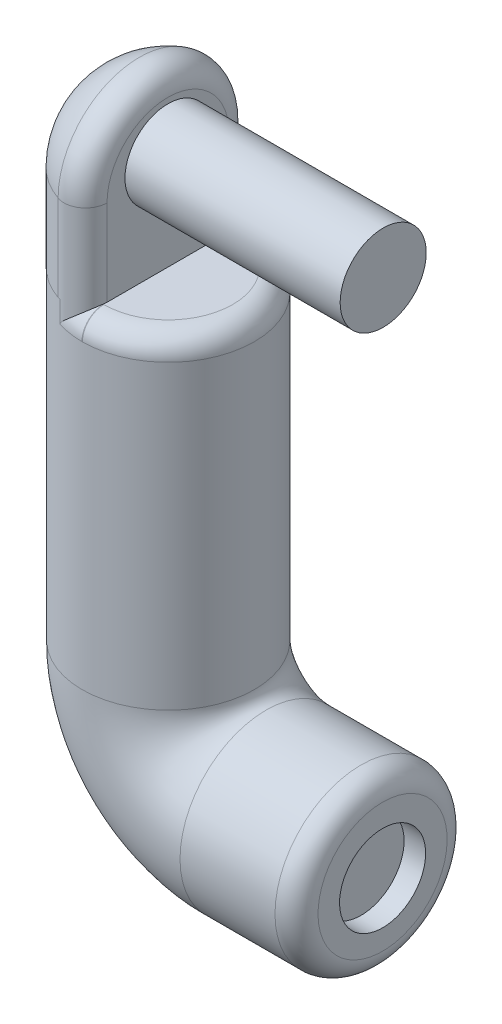
ISO-10303-21;
HEADER;
FILE_DESCRIPTION(('STEP AP214'),'2;1');
FILE_NAME('part.step','',(''),(''),'','','');
FILE_SCHEMA(('AUTOMOTIVE_DESIGN { 1 0 10303 214 1 1 1 1 }'));
ENDSEC;
DATA;
#1=APPLICATION_CONTEXT('core data for automotive mechanical design processes');
#2=APPLICATION_PROTOCOL_DEFINITION('international standard','automotive_design',2000,#1);
#3=PRODUCT_CONTEXT('',#1,'mechanical');
#4=PRODUCT('Part','Part','',(#3));
#5=PRODUCT_RELATED_PRODUCT_CATEGORY('part','',(#4));
#6=PRODUCT_DEFINITION_FORMATION('','',#4);
#7=PRODUCT_DEFINITION_CONTEXT('part definition',#1,'design');
#8=PRODUCT_DEFINITION('design','',#6,#7);
#9=PRODUCT_DEFINITION_SHAPE('','',#8);
#10=(LENGTH_UNIT() NAMED_UNIT(*) SI_UNIT(.MILLI.,.METRE.));
#11=(NAMED_UNIT(*) PLANE_ANGLE_UNIT() SI_UNIT($,.RADIAN.));
#12=(NAMED_UNIT(*) SI_UNIT($,.STERADIAN.) SOLID_ANGLE_UNIT());
#13=UNCERTAINTY_MEASURE_WITH_UNIT(LENGTH_MEASURE(1.E-05),#10,'distance_accuracy_value','');
#14=(GEOMETRIC_REPRESENTATION_CONTEXT(3) GLOBAL_UNCERTAINTY_ASSIGNED_CONTEXT((#13)) GLOBAL_UNIT_ASSIGNED_CONTEXT((#10,
#11,#12)) REPRESENTATION_CONTEXT('',''));
#15=CARTESIAN_POINT('',(0.,0.,0.));
#16=DIRECTION('',(0.,0.,1.));
#17=DIRECTION('',(1.,0.,0.));
#18=AXIS2_PLACEMENT_3D('',#15,#16,#17);
#19=CARTESIAN_POINT('',(0.233049817326039,123.081090577824,-3.54676401148078E-13));
#20=DIRECTION('',(0.,-1.,0.));
#21=DIRECTION('',(1.,0.,0.));
#22=AXIS2_PLACEMENT_3D('',#19,#20,#21);
#23=PLANE('',#22);
#24=CARTESIAN_POINT('',(-9.88347509124235,123.081090577824,28.3251993836025));
#25=DIRECTION('',(0.,-1.,0.));
#26=DIRECTION('',(1.,0.,0.));
#27=AXIS2_PLACEMENT_3D('',#24,#25,#26);
#28=CIRCLE('',#27,10.);
#29=CARTESIAN_POINT('',(0.11652490875765,123.081090577824,28.3251993835685));
#30=VERTEX_POINT('',#29);
#31=CARTESIAN_POINT('',(-0.0245326646534129,123.081090577824,29.9988941673682));
#32=VERTEX_POINT('',#31);
#33=EDGE_CURVE('E133',#30,#32,#28,.T.);
#34=ORIENTED_EDGE('',*,*,#33,.T.);
#35=CARTESIAN_POINT('',(0.233049817325969,123.081090577824,-3.19149264360073E-13));
#36=DIRECTION('',(0.,-1.,0.));
#37=DIRECTION('',(1.,0.,0.));
#38=AXIS2_PLACEMENT_3D('',#35,#36,#37);
#39=CIRCLE('',#38,30.);
#40=CARTESIAN_POINT('',(0.145656135929459,123.081090577824,29.9998727054705));
#41=VERTEX_POINT('',#40);
#42=EDGE_CURVE('E64',#32,#41,#39,.F.);
#43=ORIENTED_EDGE('',*,*,#42,.T.);
#44=CARTESIAN_POINT('',(0.233049817325969,123.081090577824,-3.19149264360073E-13));
#45=DIRECTION('',(0.,-1.,0.));
#46=DIRECTION('',(1.,0.,0.));
#47=AXIS2_PLACEMENT_3D('',#44,#45,#46);
#48=CIRCLE('',#47,30.);
#49=CARTESIAN_POINT('',(0.320443498722621,123.081090577824,29.9998727054705));
#50=VERTEX_POINT('',#49);
#51=EDGE_CURVE('E193',#41,#50,#48,.F.);
#52=ORIENTED_EDGE('',*,*,#51,.T.);
#53=CARTESIAN_POINT('',(0.233049817325969,123.081090577824,-3.19149264360073E-13));
#54=DIRECTION('',(0.,-1.,0.));
#55=DIRECTION('',(1.,0.,0.));
#56=AXIS2_PLACEMENT_3D('',#53,#54,#55);
#57=CIRCLE('',#56,30.);
#58=CARTESIAN_POINT('',(0.320443498928436,123.081090577824,-29.9998727054705));
#59=VERTEX_POINT('',#58);
#60=EDGE_CURVE('E188',#50,#59,#57,.F.);
#61=ORIENTED_EDGE('',*,*,#60,.T.);
#62=CARTESIAN_POINT('',(0.233049817325969,123.081090577824,-3.19149264360073E-13));
#63=DIRECTION('',(0.,-1.,0.));
#64=DIRECTION('',(1.,0.,0.));
#65=AXIS2_PLACEMENT_3D('',#62,#63,#64);
#66=CIRCLE('',#65,30.);
#67=CARTESIAN_POINT('',(0.131090558178022,123.081090577824,-29.9998267379912));
#68=VERTEX_POINT('',#67);
#69=EDGE_CURVE('E190',#59,#68,#66,.F.);
#70=ORIENTED_EDGE('',*,*,#69,.T.);
#71=CARTESIAN_POINT('',(0.233049817325969,123.081090577824,-3.19149264360073E-13));
#72=DIRECTION('',(0.,-1.,0.));
#73=DIRECTION('',(1.,0.,0.));
#74=AXIS2_PLACEMENT_3D('',#71,#72,#73);
#75=CIRCLE('',#74,30.);
#76=CARTESIAN_POINT('',(-0.0245326648572845,123.081090577824,-29.9988941673671));
#77=VERTEX_POINT('',#76);
#78=EDGE_CURVE('E130',#68,#77,#75,.F.);
#79=ORIENTED_EDGE('',*,*,#78,.T.);
#80=CARTESIAN_POINT('',(-9.88347509143486,123.081090577824,-28.3251993835344));
#81=DIRECTION('',(0.,-1.,0.));
#82=DIRECTION('',(1.,0.,0.));
#83=AXIS2_PLACEMENT_3D('',#80,#81,#82);
#84=CIRCLE('',#83,10.);
#85=CARTESIAN_POINT('',(0.116524908565141,123.081090577824,-28.3251993835684));
#86=VERTEX_POINT('',#85);
#87=EDGE_CURVE('E125',#77,#86,#84,.T.);
#88=ORIENTED_EDGE('',*,*,#87,.T.);
#89=DIRECTION('',(3.3981932046646E-12,0.,1.));
#90=VECTOR('',#89,1.);
#91=CARTESIAN_POINT('',(0.116524908525468,123.081090577824,-39.9998302739606));
#92=LINE('',#91,#90);
#93=EDGE_CURVE('E127',#86,#30,#92,.T.);
#94=ORIENTED_EDGE('',*,*,#93,.T.);
#95=EDGE_LOOP('',(#34,#43,#52,#61,#70,#79,#88,#94));
#96=FACE_BOUND('',#95,.T.);
#97=ADVANCED_FACE('F39',(#96),#23,.F.);
#98=CARTESIAN_POINT('',(99.8325317529746,-72.3904738901975,-3.54676401148078E-13));
#99=DIRECTION('',(1.,0.,0.));
#100=DIRECTION('',(0.,1.,0.));
#101=AXIS2_PLACEMENT_3D('',#98,#99,#100);
#102=PLANE('',#101);
#103=CARTESIAN_POINT('',(99.8325317529746,-72.3904738901975,-3.90203537936083E-13));
#104=DIRECTION('',(1.,0.,0.));
#105=DIRECTION('',(0.,1.,0.));
#106=AXIS2_PLACEMENT_3D('',#103,#104,#105);
#107=CIRCLE('',#106,30.);
#108=CARTESIAN_POINT('',(99.8325317529744,-42.3904738901975,-3.90203537936083E-13));
#109=VERTEX_POINT('',#108);
#110=EDGE_CURVE('E498',#109,#109,#107,.T.);
#111=ORIENTED_EDGE('',*,*,#110,.T.);
#112=EDGE_LOOP('',(#111));
#113=FACE_BOUND('',#112,.T.);
#114=CARTESIAN_POINT('',(99.8325317529746,-72.961353425939,-3.54676401148076E-13));
#115=DIRECTION('',(1.,0.,0.));
#116=DIRECTION('',(0.,1.,0.));
#117=AXIS2_PLACEMENT_3D('',#114,#115,#116);
#118=CIRCLE('',#117,20.);
#119=CARTESIAN_POINT('',(99.8325317529745,-52.961353425939,-3.54676401148076E-13));
#120=VERTEX_POINT('',#119);
#121=EDGE_CURVE('E160',#120,#120,#118,.T.);
#122=ORIENTED_EDGE('',*,*,#121,.F.);
#123=EDGE_LOOP('',(#122));
#124=FACE_BOUND('',#123,.T.);
#125=ADVANCED_FACE('F237',(#113,#124),#102,.T.);
#126=CARTESIAN_POINT('',(0.233049817326039,123.081090577824,-3.54676401148078E-13));
#127=DIRECTION('',(0.,-1.,0.));
#128=DIRECTION('',(1.,0.,0.));
#129=AXIS2_PLACEMENT_3D('',#126,#127,#128);
#130=CYLINDRICAL_SURFACE('',#129,40.);
#131=CARTESIAN_POINT('',(0.233049817326053,-26.918909422176,-3.54676401148078E-13));
#132=DIRECTION('',(0.,-1.,0.));
#133=DIRECTION('',(1.,0.,0.));
#134=AXIS2_PLACEMENT_3D('',#131,#132,#133);
#135=CIRCLE('',#134,40.);
#136=CARTESIAN_POINT('',(-39.7669501826739,-26.918909422176,-3.54676401148078E-13));
#137=VERTEX_POINT('',#136);
#138=EDGE_CURVE('E175',#137,#137,#135,.T.);
#139=ORIENTED_EDGE('',*,*,#138,.F.);
#140=EDGE_LOOP('',(#139));
#141=FACE_BOUND('',#140,.T.);
#142=CARTESIAN_POINT('',(0.23304981732604,113.081090577824,-3.54676401148078E-13));
#143=DIRECTION('',(0.,-1.,0.));
#144=DIRECTION('',(1.,0.,0.));
#145=AXIS2_PLACEMENT_3D('',#142,#143,#144);
#146=CIRCLE('',#145,40.);
#147=CARTESIAN_POINT('',(0.116524908797359,113.081090577824,39.9998302739607));
#148=VERTEX_POINT('',#147);
#149=CARTESIAN_POINT('',(-11.8622482588306,113.081090577824,38.12746732277));
#150=VERTEX_POINT('',#149);
#151=EDGE_CURVE('E296',#148,#150,#146,.T.);
#152=ORIENTED_EDGE('',*,*,#151,.T.);
#153=DIRECTION('',(0.,-1.,0.));
#154=VECTOR('',#153,1.);
#155=CARTESIAN_POINT('',(-11.8622482588306,113.081090577824,38.12746732277));
#156=LINE('',#155,#154);
#157=CARTESIAN_POINT('',(-11.8622482588301,123.081090577824,38.1274673227702));
#158=VERTEX_POINT('',#157);
#159=EDGE_CURVE('E191',#150,#158,#156,.F.);
#160=ORIENTED_EDGE('',*,*,#159,.T.);
#161=CARTESIAN_POINT('',(0.233049817326039,123.081090577824,-3.54676401148078E-13));
#162=DIRECTION('',(0.,-1.,0.));
#163=DIRECTION('',(1.,0.,0.));
#164=AXIS2_PLACEMENT_3D('',#161,#162,#163);
#165=CIRCLE('',#164,40.);
#166=CARTESIAN_POINT('',(-11.8622482590893,123.081090577824,-38.1274673226887));
#167=VERTEX_POINT('',#166);
#168=EDGE_CURVE('E170',#158,#167,#165,.T.);
#169=ORIENTED_EDGE('',*,*,#168,.T.);
#170=DIRECTION('',(0.,-1.,0.));
#171=VECTOR('',#170,1.);
#172=CARTESIAN_POINT('',(-11.8622482590893,123.081090577824,-38.1274673226886));
#173=LINE('',#172,#171);
#174=CARTESIAN_POINT('',(-11.8622482590891,113.081090577824,-38.1274673226887));
#175=VERTEX_POINT('',#174);
#176=EDGE_CURVE('E56',#167,#175,#173,.T.);
#177=ORIENTED_EDGE('',*,*,#176,.T.);
#178=CARTESIAN_POINT('',(0.23304981732604,113.081090577824,-3.54676401148078E-13));
#179=DIRECTION('',(0.,-1.,0.));
#180=DIRECTION('',(1.,0.,0.));
#181=AXIS2_PLACEMENT_3D('',#178,#179,#180);
#182=CIRCLE('',#181,40.);
#183=CARTESIAN_POINT('',(0.0971041384621103,113.081090577824,-39.9997689839882));
#184=VERTEX_POINT('',#183);
#185=EDGE_CURVE('E293',#175,#184,#182,.T.);
#186=ORIENTED_EDGE('',*,*,#185,.T.);
#187=CARTESIAN_POINT('',(0.23304981732604,113.081090577824,-3.54676401148078E-13));
#188=DIRECTION('',(0.,-1.,0.));
#189=DIRECTION('',(1.,0.,0.));
#190=AXIS2_PLACEMENT_3D('',#187,#188,#189);
#191=CIRCLE('',#190,40.);
#192=CARTESIAN_POINT('',(0.349574726129329,113.081090577824,-39.9998302739606));
#193=VERTEX_POINT('',#192);
#194=EDGE_CURVE('E289',#184,#193,#191,.T.);
#195=ORIENTED_EDGE('',*,*,#194,.T.);
#196=CARTESIAN_POINT('',(0.23304981732604,113.081090577824,-3.54676401148078E-13));
#197=DIRECTION('',(0.,-1.,0.));
#198=DIRECTION('',(1.,0.,0.));
#199=AXIS2_PLACEMENT_3D('',#196,#197,#198);
#200=CIRCLE('',#199,40.);
#201=CARTESIAN_POINT('',(0.349574725854909,113.081090577824,39.9998302739607));
#202=VERTEX_POINT('',#201);
#203=EDGE_CURVE('E287',#193,#202,#200,.T.);
#204=ORIENTED_EDGE('',*,*,#203,.T.);
#205=CARTESIAN_POINT('',(0.23304981732604,113.081090577824,-3.54676401148078E-13));
#206=DIRECTION('',(0.,-1.,0.));
#207=DIRECTION('',(1.,0.,0.));
#208=AXIS2_PLACEMENT_3D('',#205,#206,#207);
#209=CIRCLE('',#208,40.);
#210=EDGE_CURVE('E291',#202,#148,#209,.T.);
#211=ORIENTED_EDGE('',*,*,#210,.T.);
#212=EDGE_LOOP('',(#152,#160,#169,#177,#186,#195,#204,#211));
#213=FACE_BOUND('',#212,.T.);
#214=ADVANCED_FACE('F241',(#141,#213),#130,.T.);
#215=CARTESIAN_POINT('',(45.7046142853476,-26.9189094221759,-3.54676401148078E-13));
#216=DIRECTION('',(0.,0.,1.));
#217=DIRECTION('',(1.,0.,0.));
#218=AXIS2_PLACEMENT_3D('',#215,#216,#217);
#219=TOROIDAL_SURFACE('',#218,45.4715644680216,40.);
#220=CARTESIAN_POINT('',(45.7046142853477,-72.3904738901975,-3.54676401148078E-13));
#221=DIRECTION('',(1.,0.,0.));
#222=DIRECTION('',(0.,1.,0.));
#223=AXIS2_PLACEMENT_3D('',#220,#221,#222);
#224=CIRCLE('',#223,40.);
#225=CARTESIAN_POINT('',(45.7046142853477,-112.390473890198,-3.54676401148078E-13));
#226=VERTEX_POINT('',#225);
#227=EDGE_CURVE('E500',#226,#226,#224,.T.);
#228=CARTESIAN_POINT('',(45.7046142853476,-26.9189094221759,-3.54676401148078E-13));
#229=DIRECTION('',(0.,0.,1.));
#230=DIRECTION('',(1.,0.,0.));
#231=AXIS2_PLACEMENT_3D('',#228,#229,#230);
#232=CIRCLE('',#231,85.4715644680216);
#233=EDGE_CURVE('',#137,#226,#232,.T.);
#234=ORIENTED_EDGE('',*,*,#138,.T.);
#235=ORIENTED_EDGE('',*,*,#227,.F.);
#236=ORIENTED_EDGE('',*,*,#233,.T.);
#237=ORIENTED_EDGE('',*,*,#233,.F.);
#238=EDGE_LOOP('',(#234,#236,#235,#237));
#239=FACE_BOUND('',#238,.T.);
#240=ADVANCED_FACE('F246',(#239),#219,.T.);
#241=CARTESIAN_POINT('',(45.7046142853476,-72.3904738901975,-3.54676401148078E-13));
#242=DIRECTION('',(1.,0.,0.));
#243=DIRECTION('',(0.,0.,-1.));
#244=AXIS2_PLACEMENT_3D('',#241,#242,#243);
#245=CYLINDRICAL_SURFACE('',#244,40.);
#246=CARTESIAN_POINT('',(89.8325317529747,-72.3904738901975,-3.54676401148078E-13));
#247=DIRECTION('',(1.,0.,0.));
#248=DIRECTION('',(0.,1.,0.));
#249=AXIS2_PLACEMENT_3D('',#246,#247,#248);
#250=CIRCLE('',#249,40.);
#251=CARTESIAN_POINT('',(89.8325317529744,-32.3904738901975,-3.54676401148078E-13));
#252=VERTEX_POINT('',#251);
#253=EDGE_CURVE('E495',#252,#252,#250,.F.);
#254=ORIENTED_EDGE('',*,*,#253,.T.);
#255=EDGE_LOOP('',(#254));
#256=FACE_BOUND('',#255,.T.);
#257=ORIENTED_EDGE('',*,*,#227,.T.);
#258=EDGE_LOOP('',(#257));
#259=FACE_BOUND('',#258,.T.);
#260=ADVANCED_FACE('F238',(#256,#259),#245,.T.);
#261=CARTESIAN_POINT('',(89.8325317529746,-72.9613534259391,-3.19149264360071E-13));
#262=DIRECTION('',(1.,0.,0.));
#263=DIRECTION('',(0.,1.,0.));
#264=AXIS2_PLACEMENT_3D('',#261,#262,#263);
#265=CYLINDRICAL_SURFACE('',#264,20.);
#266=CARTESIAN_POINT('',(89.8325317529746,-72.9613534259391,-3.19149264360071E-13));
#267=DIRECTION('',(1.,0.,0.));
#268=DIRECTION('',(0.,1.,0.));
#269=AXIS2_PLACEMENT_3D('',#266,#267,#268);
#270=CIRCLE('',#269,20.);
#271=CARTESIAN_POINT('',(89.8325317529745,-52.9613534259391,-3.19149264360071E-13));
#272=VERTEX_POINT('',#271);
#273=EDGE_CURVE('E167',#272,#272,#270,.T.);
#274=ORIENTED_EDGE('',*,*,#273,.F.);
#275=EDGE_LOOP('',(#274));
#276=FACE_BOUND('',#275,.T.);
#277=ORIENTED_EDGE('',*,*,#121,.T.);
#278=EDGE_LOOP('',(#277));
#279=FACE_BOUND('',#278,.T.);
#280=ADVANCED_FACE('F243',(#276,#279),#265,.F.);
#281=CARTESIAN_POINT('',(89.8325317529746,-72.9613534259391,-3.19149264360071E-13));
#282=DIRECTION('',(1.,0.,0.));
#283=DIRECTION('',(0.,1.,0.));
#284=AXIS2_PLACEMENT_3D('',#281,#282,#283);
#285=PLANE('',#284);
#286=ORIENTED_EDGE('',*,*,#273,.T.);
#287=EDGE_LOOP('',(#286));
#288=FACE_BOUND('',#287,.T.);
#289=ADVANCED_FACE('F233',(#288),#285,.T.);
#290=CARTESIAN_POINT('',(89.8325317529746,-72.3904738901975,-3.54676401148078E-13));
#291=DIRECTION('',(1.,0.,0.));
#292=DIRECTION('',(0.,1.,0.));
#293=AXIS2_PLACEMENT_3D('',#290,#291,#292);
#294=TOROIDAL_SURFACE('',#293,30.,10.);
#295=ORIENTED_EDGE('',*,*,#253,.F.);
#296=EDGE_LOOP('',(#295));
#297=FACE_BOUND('',#296,.T.);
#298=ORIENTED_EDGE('',*,*,#110,.F.);
#299=EDGE_LOOP('',(#298));
#300=FACE_BOUND('',#299,.T.);
#301=ADVANCED_FACE('F229',(#297,#300),#294,.T.);
#302=CARTESIAN_POINT('',(-1.43014927975443E-12,203.081090577824,7.21488968401559E-13));
#303=DIRECTION('',(0.,-1.,0.));
#304=DIRECTION('',(1.,0.,0.));
#305=AXIS2_PLACEMENT_3D('',#302,#303,#304);
#306=CYLINDRICAL_SURFACE('',#305,40.);
#307=CARTESIAN_POINT('',(-1.14845899028725E-12,163.081090577824,5.79380421249539E-13));
#308=DIRECTION('',(0.,-1.,0.));
#309=DIRECTION('',(1.,0.,0.));
#310=AXIS2_PLACEMENT_3D('',#307,#308,#309);
#311=CIRCLE('',#310,40.);
#312=CARTESIAN_POINT('',(-13.177966788323,163.081090577824,37.76693251147));
#313=VERTEX_POINT('',#312);
#314=CARTESIAN_POINT('',(-13.1779667885798,163.081090577824,-37.7669325113792));
#315=VERTEX_POINT('',#314);
#316=EDGE_CURVE('E490',#313,#315,#311,.T.);
#317=ORIENTED_EDGE('',*,*,#316,.T.);
#318=DIRECTION('',(0.,-1.,0.));
#319=VECTOR('',#318,1.);
#320=CARTESIAN_POINT('',(-13.1779667885801,203.081090577824,-37.7669325113791));
#321=LINE('',#320,#319);
#322=CARTESIAN_POINT('',(-13.1779667885795,123.081090577824,-37.7669325113794));
#323=VERTEX_POINT('',#322);
#324=EDGE_CURVE('E153',#315,#323,#321,.T.);
#325=ORIENTED_EDGE('',*,*,#324,.T.);
#326=CARTESIAN_POINT('',(-8.66768700820077E-13,123.081090577824,4.37271874097519E-13));
#327=DIRECTION('',(0.,1.,0.));
#328=DIRECTION('',(-1.,0.,0.));
#329=AXIS2_PLACEMENT_3D('',#326,#327,#328);
#330=CIRCLE('',#329,40.);
#331=CARTESIAN_POINT('',(-13.1779667883228,123.081090577824,37.7669325114698));
#332=VERTEX_POINT('',#331);
#333=EDGE_CURVE('E142',#323,#332,#330,.T.);
#334=ORIENTED_EDGE('',*,*,#333,.T.);
#335=DIRECTION('',(0.,-1.,0.));
#336=VECTOR('',#335,1.);
#337=CARTESIAN_POINT('',(-13.1779667883234,203.081090577824,37.7669325114701));
#338=LINE('',#337,#336);
#339=EDGE_CURVE('E150',#332,#313,#338,.F.);
#340=ORIENTED_EDGE('',*,*,#339,.T.);
#341=EDGE_LOOP('',(#317,#325,#334,#340));
#342=FACE_BOUND('',#341,.T.);
#343=ADVANCED_FACE('F232',(#342),#306,.T.);
#344=CARTESIAN_POINT('',(-8.66768700820077E-13,123.081090577824,4.37271874097519E-13));
#345=DIRECTION('',(0.,1.,0.));
#346=DIRECTION('',(-1.,0.,0.));
#347=AXIS2_PLACEMENT_3D('',#344,#345,#346);
#348=PLANE('',#347);
#349=ORIENTED_EDGE('',*,*,#333,.F.);
#350=CARTESIAN_POINT('',(-9.88347509143486,123.081090577824,-28.3251993835344));
#351=DIRECTION('',(0.,1.,0.));
#352=DIRECTION('',(-1.,0.,0.));
#353=AXIS2_PLACEMENT_3D('',#350,#351,#352);
#354=CIRCLE('',#353,10.);
#355=EDGE_CURVE('E180',#323,#167,#354,.F.);
#356=ORIENTED_EDGE('',*,*,#355,.T.);
#357=ORIENTED_EDGE('',*,*,#168,.F.);
#358=CARTESIAN_POINT('',(-9.88347509124235,123.081090577824,28.3251993836025));
#359=DIRECTION('',(0.,1.,0.));
#360=DIRECTION('',(-1.,0.,0.));
#361=AXIS2_PLACEMENT_3D('',#358,#359,#360);
#362=CIRCLE('',#361,10.);
#363=EDGE_CURVE('E307',#158,#332,#362,.F.);
#364=ORIENTED_EDGE('',*,*,#363,.T.);
#365=EDGE_LOOP('',(#349,#356,#357,#364));
#366=FACE_BOUND('',#365,.T.);
#367=ADVANCED_FACE('F262',(#366),#348,.F.);
#368=CARTESIAN_POINT('',(0.116524908525468,123.081090577824,-39.9998302739606));
#369=DIRECTION('',(-1.,0.,3.3981932046646E-12));
#370=DIRECTION('',(3.3981932046646E-12,0.,1.));
#371=AXIS2_PLACEMENT_3D('',#368,#369,#370);
#372=PLANE('',#371);
#373=CARTESIAN_POINT('',(0.116524908661084,168.815460190338,-3.95974152790325E-13));
#374=DIRECTION('',(-1.,0.,3.3981932046646E-12));
#375=DIRECTION('',(3.3981932046646E-12,0.,1.));
#376=AXIS2_PLACEMENT_3D('',#373,#374,#375);
#377=CIRCLE('',#376,20.);
#378=CARTESIAN_POINT('',(0.116524908729048,168.815460190338,19.9999999999996));
#379=VERTEX_POINT('',#378);
#380=EDGE_CURVE('E488',#379,#379,#377,.F.);
#381=ORIENTED_EDGE('',*,*,#380,.F.);
#382=EDGE_LOOP('',(#381));
#383=FACE_BOUND('',#382,.T.);
#384=ORIENTED_EDGE('',*,*,#93,.F.);
#385=DIRECTION('',(0.,-1.,0.));
#386=VECTOR('',#385,1.);
#387=CARTESIAN_POINT('',(0.116524908565141,123.081090577824,-28.3251993835684));
#388=LINE('',#387,#386);
#389=CARTESIAN_POINT('',(0.116524908564859,163.081090577824,-28.3251993835683));
#390=VERTEX_POINT('',#389);
#391=EDGE_CURVE('E139',#86,#390,#388,.F.);
#392=ORIENTED_EDGE('',*,*,#391,.T.);
#393=CARTESIAN_POINT('',(0.116524908661115,163.081090577824,1.83406268459278E-13));
#394=DIRECTION('',(-1.,0.,3.3981932046646E-12));
#395=DIRECTION('',(3.3981932046646E-12,0.,1.));
#396=AXIS2_PLACEMENT_3D('',#393,#394,#395);
#397=CIRCLE('',#396,28.3251993835684);
#398=CARTESIAN_POINT('',(0.116524908757368,163.081090577824,28.3251993835686));
#399=VERTEX_POINT('',#398);
#400=EDGE_CURVE('E151',#390,#399,#397,.F.);
#401=ORIENTED_EDGE('',*,*,#400,.T.);
#402=DIRECTION('',(0.,-1.,0.));
#403=VECTOR('',#402,1.);
#404=CARTESIAN_POINT('',(0.11652490875765,123.081090577824,28.3251993835685));
#405=LINE('',#404,#403);
#406=EDGE_CURVE('E141',#399,#30,#405,.T.);
#407=ORIENTED_EDGE('',*,*,#406,.T.);
#408=EDGE_LOOP('',(#384,#392,#401,#407));
#409=FACE_BOUND('',#408,.T.);
#410=ADVANCED_FACE('F138',(#383,#409),#372,.F.);
#411=CARTESIAN_POINT('',(-1.14845899028725E-12,163.081090577824,5.79380421249539E-13));
#412=DIRECTION('',(0.,1.,0.));
#413=DIRECTION('',(-1.,0.,0.));
#414=AXIS2_PLACEMENT_3D('',#411,#412,#413);
#415=SPHERICAL_SURFACE('',#414,40.);
#416=ORIENTED_EDGE('',*,*,#316,.F.);
#417=CARTESIAN_POINT('',(-13.1779667884515,163.081090577824,4.53606576130572E-11));
#418=DIRECTION('',(1.,0.,-3.3981932046646E-12));
#419=DIRECTION('',(-3.3981932046646E-12,0.,-1.));
#420=AXIS2_PLACEMENT_3D('',#417,#418,#419);
#421=CIRCLE('',#420,37.7669325114246);
#422=EDGE_CURVE('E134',#313,#315,#421,.F.);
#423=ORIENTED_EDGE('',*,*,#422,.T.);
#424=EDGE_LOOP('',(#416,#423));
#425=FACE_BOUND('',#424,.T.);
#426=ADVANCED_FACE('F224',(#425),#415,.T.);
#427=CARTESIAN_POINT('',(100.116524908661,168.815460190339,-3.4021529461925E-10));
#428=DIRECTION('',(-1.,0.,3.3981932046646E-12));
#429=DIRECTION('',(3.3981932046646E-12,0.,1.));
#430=AXIS2_PLACEMENT_3D('',#427,#428,#429);
#431=CYLINDRICAL_SURFACE('',#430,20.);
#432=CARTESIAN_POINT('',(100.116524908661,168.815460190339,-3.4021529461925E-10));
#433=DIRECTION('',(1.,0.,-3.3981932046646E-12));
#434=DIRECTION('',(-3.3981932046646E-12,0.,-1.));
#435=AXIS2_PLACEMENT_3D('',#432,#433,#434);
#436=CIRCLE('',#435,20.);
#437=CARTESIAN_POINT('',(100.116524908593,168.815460190339,-20.0000000003402));
#438=VERTEX_POINT('',#437);
#439=EDGE_CURVE('E143',#438,#438,#436,.T.);
#440=ORIENTED_EDGE('',*,*,#439,.F.);
#441=EDGE_LOOP('',(#440));
#442=FACE_BOUND('',#441,.T.);
#443=ORIENTED_EDGE('',*,*,#380,.T.);
#444=EDGE_LOOP('',(#443));
#445=FACE_BOUND('',#444,.T.);
#446=ADVANCED_FACE('F227',(#442,#445),#431,.T.);
#447=CARTESIAN_POINT('',(100.116524908661,168.815460190339,-3.4021529461925E-10));
#448=DIRECTION('',(1.,0.,-3.3981932046646E-12));
#449=DIRECTION('',(-3.3981932046646E-12,0.,-1.));
#450=AXIS2_PLACEMENT_3D('',#447,#448,#449);
#451=PLANE('',#450);
#452=ORIENTED_EDGE('',*,*,#439,.T.);
#453=EDGE_LOOP('',(#452));
#454=FACE_BOUND('',#453,.T.);
#455=ADVANCED_FACE('F217',(#454),#451,.T.);
#456=CARTESIAN_POINT('',(-9.88347509124291,203.081090577824,28.3251993836028));
#457=DIRECTION('',(0.,-1.,0.));
#458=DIRECTION('',(1.,0.,0.));
#459=AXIS2_PLACEMENT_3D('',#456,#457,#458);
#460=CYLINDRICAL_SURFACE('',#459,10.);
#461=ORIENTED_EDGE('',*,*,#33,.F.);
#462=ORIENTED_EDGE('',*,*,#406,.F.);
#463=CARTESIAN_POINT('',(-9.88347509124263,163.081090577824,28.3251993836026));
#464=DIRECTION('',(0.,1.,0.));
#465=DIRECTION('',(-1.,0.,0.));
#466=AXIS2_PLACEMENT_3D('',#463,#464,#465);
#467=CIRCLE('',#466,10.);
#468=EDGE_CURVE('E279',#313,#399,#467,.T.);
#469=ORIENTED_EDGE('',*,*,#468,.F.);
#470=ORIENTED_EDGE('',*,*,#339,.F.);
#471=ORIENTED_EDGE('',*,*,#363,.F.);
#472=ORIENTED_EDGE('',*,*,#159,.F.);
#473=CARTESIAN_POINT('',(-11.8622482588306,113.081090577824,38.12746732277));
#474=CARTESIAN_POINT('',(-11.8625846427038,113.155159932346,38.1273787821243));
#475=CARTESIAN_POINT('',(-11.8547631229124,113.228607748018,38.1289812630567));
#476=CARTESIAN_POINT('',(-11.826488607856,113.371310891595,38.1346334347299));
#477=CARTESIAN_POINT('',(-11.806323367247,113.440623339204,38.138627332169));
#478=CARTESIAN_POINT('',(-11.7413122983769,113.617594164173,38.1511851076447));
#479=CARTESIAN_POINT('',(-11.6889172682856,113.722230306315,38.1610458549671));
#480=CARTESIAN_POINT('',(-11.5705956001566,113.924799246219,38.1820421233531));
#481=CARTESIAN_POINT('',(-11.5044877786692,114.02261607919,38.1931937248018));
#482=CARTESIAN_POINT('',(-11.3594871865429,114.220039257318,38.2159617600537));
#483=CARTESIAN_POINT('',(-11.2800028432376,114.319208050632,38.227548303016));
#484=CARTESIAN_POINT('',(-11.1158468408268,114.513352782485,38.2493198292487));
#485=CARTESIAN_POINT('',(-11.0311713471112,114.608325530166,38.2595037579582));
#486=CARTESIAN_POINT('',(-10.7718406719701,114.889340778116,38.2871736601629));
#487=CARTESIAN_POINT('',(-10.5922110246515,115.071069708688,38.3017235353379));
#488=CARTESIAN_POINT('',(-10.2263574568144,115.428171051477,38.3210085697214));
#489=CARTESIAN_POINT('',(-10.0401334636529,115.603543393627,38.3257436207761));
#490=CARTESIAN_POINT('',(-9.66389036175812,115.9496858109,38.3245561539728));
#491=CARTESIAN_POINT('',(-9.47387578748022,116.120460870815,38.3186456937909));
#492=CARTESIAN_POINT('',(-8.94873248048716,116.58477191279,38.2870310339024));
#493=CARTESIAN_POINT('',(-8.61112723893113,116.874817479465,38.2498473935935));
#494=CARTESIAN_POINT('',(-7.93374793643084,117.44587358467,38.1393009029539));
#495=CARTESIAN_POINT('',(-7.5939723803574,117.726876848222,38.0659096606004));
#496=CARTESIAN_POINT('',(-6.91681731845912,118.278662836843,37.881452004522));
#497=CARTESIAN_POINT('',(-6.57943590194102,118.549454693631,37.7704201841954));
#498=CARTESIAN_POINT('',(-5.91082941902315,119.079321208728,37.5092527893121));
#499=CARTESIAN_POINT('',(-5.57960114985188,119.338402069454,37.3591382055638));
#500=CARTESIAN_POINT('',(-5.01781362298958,119.772591646588,37.065681465558));
#501=CARTESIAN_POINT('',(-4.78479990381267,119.95107009692,36.9319962765702));
#502=CARTESIAN_POINT('',(-4.32592106126649,120.299439623639,36.6430820699197));
#503=CARTESIAN_POINT('',(-4.10005560675636,120.469331098032,36.4878540520203));
#504=CARTESIAN_POINT('',(-3.43655156544015,120.963669273875,35.9895620777361));
#505=CARTESIAN_POINT('',(-3.01195940059931,121.273587162591,35.6133565010151));
#506=CARTESIAN_POINT('',(-2.29853033715346,121.780988905528,34.858215599384));
#507=CARTESIAN_POINT('',(-1.9996845497993,121.988505992691,34.4955570996661));
#508=CARTESIAN_POINT('',(-1.58586876111499,122.266287690305,33.911502557639));
#509=CARTESIAN_POINT('',(-1.45364770068508,122.353314308518,33.7100925050395));
#510=CARTESIAN_POINT('',(-1.20217366392541,122.514804773772,33.2944972303157));
#511=CARTESIAN_POINT('',(-1.08291816061409,122.58927107038,33.0803145102251));
#512=CARTESIAN_POINT('',(-0.876727772778997,122.713434045896,32.6751068345152));
#513=CARTESIAN_POINT('',(-0.787665730769412,122.765185883036,32.4857896262793));
#514=CARTESIAN_POINT('',(-0.620787256183076,122.857806197605,32.099694567799));
#515=CARTESIAN_POINT('',(-0.542968610497155,122.89867681819,31.9029181954419));
#516=CARTESIAN_POINT('',(-0.399596859651803,122.968582745409,31.5034068878174));
#517=CARTESIAN_POINT('',(-0.334016633553275,122.997644393851,31.3006863080811));
#518=CARTESIAN_POINT('',(-0.215687650655653,123.043254486966,30.8902413280239));
#519=CARTESIAN_POINT('',(-0.162930628428015,123.059811006629,30.6825202462846));
#520=CARTESIAN_POINT('',(-0.0995778028734726,123.073547824456,30.3944622529328));
#521=CARTESIAN_POINT('',(-0.083230135924711,123.076371385124,30.3155994769662));
#522=CARTESIAN_POINT('',(-0.0524476133707275,123.080142022531,30.1575133343777));
#523=CARTESIAN_POINT('',(-0.0380114485735165,123.081090389863,30.0782902533986));
#524=CARTESIAN_POINT('',(-0.0245326646534129,123.081090577824,29.9988941673682));
#525=B_SPLINE_CURVE_WITH_KNOTS('',3,(#473,#474,#475,#476,#477,#478,#479,#480,#481,#482,#483,
#484,#485,#486,#487,#488,#489,#490,#491,#492,#493,#494,#495,#496,#497,#498,#499,#500,#501,#502,
#503,#504,#505,#506,#507,#508,#509,#510,#511,#512,#513,#514,#515,#516,#517,#518,#519,#520,#521,
#522,#523,#524),.UNSPECIFIED.,.F.,.F.,(4,2,2,2,2,2,2,2,2,2,2,2,2,2,2,2,2,2,2,2,2,2,2,2,2,4),(0.,
0.220800051036636,0.436639127825672,0.786988992507637,1.14230217781867,1.52485071857163,
1.90768532787532,2.67493794996915,3.44219902670079,4.20859160888757,5.54689299891193,
6.88624548374025,8.22437036497432,9.56177803524966,10.5284649837456,11.4951070850638,
13.4241605705362,14.9589002854529,15.7265988850073,16.4941475911873,17.1400827092752,
17.7858905101248,18.4302497184931,19.0741924854397,19.315923393835,19.5574878742467),.UNSPECIFIED.);
#526=EDGE_CURVE('E49',#150,#32,#525,.T.);
#527=ORIENTED_EDGE('',*,*,#526,.T.);
#528=EDGE_LOOP('',(#461,#462,#469,#470,#471,#472,#527));
#529=FACE_BOUND('',#528,.T.);
#530=ADVANCED_FACE('F212',(#529),#460,.T.);
#531=CARTESIAN_POINT('',(-9.88347509133889,163.081090577824,3.41653383151053E-11));
#532=DIRECTION('',(-1.,0.,3.3981932046646E-12));
#533=DIRECTION('',(3.3981932046646E-12,0.,1.));
#534=AXIS2_PLACEMENT_3D('',#531,#532,#533);
#535=TOROIDAL_SURFACE('',#534,28.3251993835684,10.);
#536=ORIENTED_EDGE('',*,*,#468,.T.);
#537=ORIENTED_EDGE('',*,*,#400,.F.);
#538=CARTESIAN_POINT('',(-9.88347509143514,163.081090577824,-28.3251993835343));
#539=DIRECTION('',(0.,-1.,0.));
#540=DIRECTION('',(1.,0.,0.));
#541=AXIS2_PLACEMENT_3D('',#538,#539,#540);
#542=CIRCLE('',#541,10.);
#543=EDGE_CURVE('E148',#315,#390,#542,.T.);
#544=ORIENTED_EDGE('',*,*,#543,.F.);
#545=ORIENTED_EDGE('',*,*,#422,.F.);
#546=EDGE_LOOP('',(#536,#537,#544,#545));
#547=FACE_BOUND('',#546,.T.);
#548=ADVANCED_FACE('F216',(#547),#535,.T.);
#549=CARTESIAN_POINT('',(-9.88347509143542,203.081090577824,-28.3251993835341));
#550=DIRECTION('',(0.,-1.,0.));
#551=DIRECTION('',(1.,0.,0.));
#552=AXIS2_PLACEMENT_3D('',#549,#550,#551);
#553=CYLINDRICAL_SURFACE('',#552,10.);
#554=ORIENTED_EDGE('',*,*,#355,.F.);
#555=ORIENTED_EDGE('',*,*,#324,.F.);
#556=ORIENTED_EDGE('',*,*,#543,.T.);
#557=ORIENTED_EDGE('',*,*,#391,.F.);
#558=ORIENTED_EDGE('',*,*,#87,.F.);
#559=CARTESIAN_POINT('',(-0.0245326648572828,123.081090577824,-29.9988941673671));
#560=CARTESIAN_POINT('',(-0.0439639693750962,123.081091901959,-30.1133653313601));
#561=CARTESIAN_POINT('',(-0.0653896181605822,123.079118984179,-30.2274775808646));
#562=CARTESIAN_POINT('',(-0.112166484085848,123.071306140227,-30.454749500361));
#563=CARTESIAN_POINT('',(-0.137517297515769,123.065466611541,-30.5679092670567));
#564=CARTESIAN_POINT('',(-0.21930326482155,123.042288430253,-30.9053699617353));
#565=CARTESIAN_POINT('',(-0.281519376115608,123.019289780367,-31.1279309708735));
#566=CARTESIAN_POINT('',(-0.419956176089435,122.959335954636,-31.5646263493315));
#567=CARTESIAN_POINT('',(-0.496058507987921,122.922496135053,-31.7788146404744));
#568=CARTESIAN_POINT('',(-0.661629817647948,122.835865362099,-32.1992968072502));
#569=CARTESIAN_POINT('',(-0.751101620614181,122.786071669694,-32.4055890026969));
#570=CARTESIAN_POINT('',(-0.941901339273345,122.674867248547,-32.8082455530767));
#571=CARTESIAN_POINT('',(-1.0431795374963,122.613504607818,-33.0046468846566));
#572=CARTESIAN_POINT('',(-1.25679237127554,122.48010079897,-33.3876546732785));
#573=CARTESIAN_POINT('',(-1.36913184202387,122.408054953898,-33.5742567916708));
#574=CARTESIAN_POINT('',(-1.60392105657854,122.254221483143,-33.937311994117));
#575=CARTESIAN_POINT('',(-1.72638930790582,122.172415897985,-34.1137454534957));
#576=CARTESIAN_POINT('',(-1.98017319304784,122.000161673329,-34.4557114774576));
#577=CARTESIAN_POINT('',(-2.11149066187515,121.909711239561,-34.6212417669522));
#578=CARTESIAN_POINT('',(-2.43277448858066,121.685630642843,-35.001282692484));
#579=CARTESIAN_POINT('',(-2.62623549494664,121.548547588391,-35.2108226253221));
#580=CARTESIAN_POINT('',(-3.02546642793369,121.2618864347,-35.6085481082186));
#581=CARTESIAN_POINT('',(-3.23123997279631,121.112304657334,-35.7967273335489));
#582=CARTESIAN_POINT('',(-3.6530806200619,120.802307116812,-36.1519672509649));
#583=CARTESIAN_POINT('',(-3.86915874684277,120.641879670155,-36.3190045933688));
#584=CARTESIAN_POINT('',(-4.30939206759998,120.311887009053,-36.6319769877716));
#585=CARTESIAN_POINT('',(-4.53354731027086,120.142321739515,-36.7779119125236));
#586=CARTESIAN_POINT('',(-5.05021086234132,119.747973907972,-37.0860804974861));
#587=CARTESIAN_POINT('',(-5.34468722258206,119.520745062035,-37.2419034404398));
#588=CARTESIAN_POINT('',(-5.94062148271731,119.055646855569,-37.5209705264834));
#589=CARTESIAN_POINT('',(-6.24208135194125,118.817774475537,-37.6442053551324));
#590=CARTESIAN_POINT('',(-6.84913016177072,118.332873354362,-37.8591643516396));
#591=CARTESIAN_POINT('',(-7.15472160246819,118.085838895584,-37.950868463176));
#592=CARTESIAN_POINT('',(-7.76686037360012,117.583923344222,-38.1037156003326));
#593=CARTESIAN_POINT('',(-8.07340728866649,117.329045323063,-38.1648704309364));
#594=CARTESIAN_POINT('',(-8.65389709057859,116.837571766787,-38.2532166625494));
#595=CARTESIAN_POINT('',(-8.92803467602833,116.601697030993,-38.283193036159));
#596=CARTESIAN_POINT('',(-9.47051646764923,116.124442297029,-38.3203380216796));
#597=CARTESIAN_POINT('',(-9.73888366840667,115.883098075313,-38.3276265963931));
#598=CARTESIAN_POINT('',(-10.1715929534156,115.479554483682,-38.322479729902));
#599=CARTESIAN_POINT('',(-10.3386227810226,115.320120924837,-38.3161972345748));
#600=CARTESIAN_POINT('',(-10.6687919912389,114.993470912373,-38.2956956462037));
#601=CARTESIAN_POINT('',(-10.8318540686114,114.826180895289,-38.2813758594716));
#602=CARTESIAN_POINT('',(-11.0691195800299,114.565825367044,-38.2549934743554));
#603=CARTESIAN_POINT('',(-11.1477235603527,114.476542248567,-38.245261205572));
#604=CARTESIAN_POINT('',(-11.3003870906591,114.29383144203,-38.2246072424541));
#605=CARTESIAN_POINT('',(-11.3744344738747,114.200393715665,-38.2136825628514));
#606=CARTESIAN_POINT('',(-11.5128140672034,114.010482617667,-38.191810301446));
#607=CARTESIAN_POINT('',(-11.5773577912317,113.914163889116,-38.1808716494511));
#608=CARTESIAN_POINT('',(-11.6932179108266,113.713840821691,-38.160251043259));
#609=CARTESIAN_POINT('',(-11.744609945951,113.609885071162,-38.1505620693331));
#610=CARTESIAN_POINT('',(-11.7960428320375,113.46818113304,-38.1406079722452));
#611=CARTESIAN_POINT('',(-11.8069710942819,113.434546131973,-38.1384688638036));
#612=CARTESIAN_POINT('',(-11.826144816076,113.366490423467,-38.134691244099));
#613=CARTESIAN_POINT('',(-11.8343910208341,113.332069937124,-38.1330525937916));
#614=CARTESIAN_POINT('',(-11.8549379115727,113.226264778949,-38.1289492508228));
#615=CARTESIAN_POINT('',(-11.862443733306,113.153911561235,-38.1274160625076));
#616=CARTESIAN_POINT('',(-11.862248259089,113.081090577824,-38.1274673226887));
#617=B_SPLINE_CURVE_WITH_KNOTS('',3,(#559,#560,#561,#562,#563,#564,#565,#566,#567,#568,#569,
#570,#571,#572,#573,#574,#575,#576,#577,#578,#579,#580,#581,#582,#583,#584,#585,#586,#587,#588,
#589,#590,#591,#592,#593,#594,#595,#596,#597,#598,#599,#600,#601,#602,#603,#604,#605,#606,#607,
#608,#609,#610,#611,#612,#613,#614,#615,#616),.UNSPECIFIED.,.F.,.F.,(4,2,2,2,2,2,2,2,2,2,2,2,2,
2,2,2,2,2,2,2,2,2,2,2,2,2,2,2,4),(0.,0.348253175559797,0.696470556452201,1.39206075602555,
2.0819778695992,2.77204098152777,3.45929657847825,4.14685393919399,4.83569661710957,
5.52468257864629,6.47259308474429,7.42078353117033,8.37001221338322,9.31924661917156,
10.5273805759642,11.7358594732144,12.9451056538465,14.1538841902339,15.2417749751923,
16.3239036296797,17.0166977175267,17.7183715588419,18.0763342119546,18.435214543714,
18.7842037066478,19.1311381701772,19.2373338734696,19.3435000450732,19.5608249479782),.UNSPECIFIED.);
#618=EDGE_CURVE('E11',#77,#175,#617,.T.);
#619=ORIENTED_EDGE('',*,*,#618,.T.);
#620=ORIENTED_EDGE('',*,*,#176,.F.);
#621=EDGE_LOOP('',(#554,#555,#556,#557,#558,#619,#620));
#622=FACE_BOUND('',#621,.T.);
#623=ADVANCED_FACE('F145',(#622),#553,.T.);
#624=CARTESIAN_POINT('',(0.23304981732604,113.081090577824,-3.54676401148078E-13));
#625=DIRECTION('',(0.,-1.,0.));
#626=DIRECTION('',(1.,0.,0.));
#627=AXIS2_PLACEMENT_3D('',#624,#625,#626);
#628=TOROIDAL_SURFACE('',#627,30.,10.);
#629=ORIENTED_EDGE('',*,*,#618,.F.);
#630=ORIENTED_EDGE('',*,*,#78,.F.);
#631=CARTESIAN_POINT('',(0.131090558178093,113.081090577824,-29.9998267379913));
#632=DIRECTION('',(0.999994224599697,0.,-0.00339864197159824));
#633=DIRECTION('',(-0.00339864197159824,0.,-0.999994224599697));
#634=AXIS2_PLACEMENT_3D('',#631,#632,#633);
#635=CIRCLE('',#634,10.);
#636=EDGE_CURVE('E44',#184,#68,#635,.T.);
#637=ORIENTED_EDGE('',*,*,#636,.F.);
#638=ORIENTED_EDGE('',*,*,#185,.F.);
#639=EDGE_LOOP('',(#629,#630,#637,#638));
#640=FACE_BOUND('',#639,.T.);
#641=ADVANCED_FACE('F41',(#640),#628,.T.);
#642=CARTESIAN_POINT('',(0.23304981732604,113.081090577824,-3.54676401148078E-13));
#643=DIRECTION('',(0.,-1.,0.));
#644=DIRECTION('',(1.,0.,0.));
#645=AXIS2_PLACEMENT_3D('',#642,#643,#644);
#646=TOROIDAL_SURFACE('',#645,30.,10.);
#647=ORIENTED_EDGE('',*,*,#636,.T.);
#648=ORIENTED_EDGE('',*,*,#69,.F.);
#649=CARTESIAN_POINT('',(0.320443498928506,113.081090577824,-29.9998727054706));
#650=DIRECTION('',(0.999995756849007,0.,0.00291312272008222));
#651=DIRECTION('',(0.00291312272008222,0.,-0.999995756849007));
#652=AXIS2_PLACEMENT_3D('',#649,#650,#651);
#653=CIRCLE('',#652,10.);
#654=EDGE_CURVE('E323',#193,#59,#653,.T.);
#655=ORIENTED_EDGE('',*,*,#654,.F.);
#656=ORIENTED_EDGE('',*,*,#194,.F.);
#657=EDGE_LOOP('',(#647,#648,#655,#656));
#658=FACE_BOUND('',#657,.T.);
#659=ADVANCED_FACE('F335',(#658),#646,.T.);
#660=CARTESIAN_POINT('',(0.23304981732604,113.081090577824,-3.54676401148078E-13));
#661=DIRECTION('',(0.,-1.,0.));
#662=DIRECTION('',(1.,0.,0.));
#663=AXIS2_PLACEMENT_3D('',#660,#661,#662);
#664=TOROIDAL_SURFACE('',#663,30.,10.);
#665=ORIENTED_EDGE('',*,*,#654,.T.);
#666=ORIENTED_EDGE('',*,*,#60,.F.);
#667=CARTESIAN_POINT('',(0.320443498722692,113.081090577824,29.9998727054705));
#668=DIRECTION('',(-0.999995756849027,0.,0.00291312271322173));
#669=DIRECTION('',(0.00291312271322173,0.,0.999995756849027));
#670=AXIS2_PLACEMENT_3D('',#667,#668,#669);
#671=CIRCLE('',#670,10.);
#672=EDGE_CURVE('E321',#202,#50,#671,.T.);
#673=ORIENTED_EDGE('',*,*,#672,.F.);
#674=ORIENTED_EDGE('',*,*,#203,.F.);
#675=EDGE_LOOP('',(#665,#666,#673,#674));
#676=FACE_BOUND('',#675,.T.);
#677=ADVANCED_FACE('F339',(#676),#664,.T.);
#678=CARTESIAN_POINT('',(0.23304981732604,113.081090577824,-3.54676401148078E-13));
#679=DIRECTION('',(0.,-1.,0.));
#680=DIRECTION('',(1.,0.,0.));
#681=AXIS2_PLACEMENT_3D('',#678,#679,#680);
#682=TOROIDAL_SURFACE('',#681,30.,10.);
#683=ORIENTED_EDGE('',*,*,#672,.T.);
#684=ORIENTED_EDGE('',*,*,#51,.F.);
#685=CARTESIAN_POINT('',(0.145656135929529,113.081090577824,29.9998727054705));
#686=DIRECTION('',(-0.999995756849027,0.,-0.00291312271321701));
#687=DIRECTION('',(-0.00291312271321701,0.,0.999995756849027));
#688=AXIS2_PLACEMENT_3D('',#685,#686,#687);
#689=CIRCLE('',#688,10.);
#690=EDGE_CURVE('E318',#148,#41,#689,.T.);
#691=ORIENTED_EDGE('',*,*,#690,.F.);
#692=ORIENTED_EDGE('',*,*,#210,.F.);
#693=EDGE_LOOP('',(#683,#684,#691,#692));
#694=FACE_BOUND('',#693,.T.);
#695=ADVANCED_FACE('F340',(#694),#682,.T.);
#696=CARTESIAN_POINT('',(0.23304981732604,113.081090577824,-3.54676401148078E-13));
#697=DIRECTION('',(0.,-1.,0.));
#698=DIRECTION('',(1.,0.,0.));
#699=AXIS2_PLACEMENT_3D('',#696,#697,#698);
#700=TOROIDAL_SURFACE('',#699,30.,10.);
#701=ORIENTED_EDGE('',*,*,#690,.T.);
#702=ORIENTED_EDGE('',*,*,#42,.F.);
#703=ORIENTED_EDGE('',*,*,#526,.F.);
#704=ORIENTED_EDGE('',*,*,#151,.F.);
#705=EDGE_LOOP('',(#701,#702,#703,#704));
#706=FACE_BOUND('',#705,.T.);
#707=ADVANCED_FACE('F209',(#706),#700,.T.);
#708=CLOSED_SHELL('',(#97,#125,#214,#240,#260,#280,#289,#301,#343,#367,#410,#426,#446,#455,#530,
#548,#623,#641,#659,#677,#695,#707));
#709=MANIFOLD_SOLID_BREP('B2',#708);
#710=ADVANCED_BREP_SHAPE_REPRESENTATION('',(#18,#709),#14);
#711=SHAPE_DEFINITION_REPRESENTATION(#9,#710);
ENDSEC;
END-ISO-10303-21;
